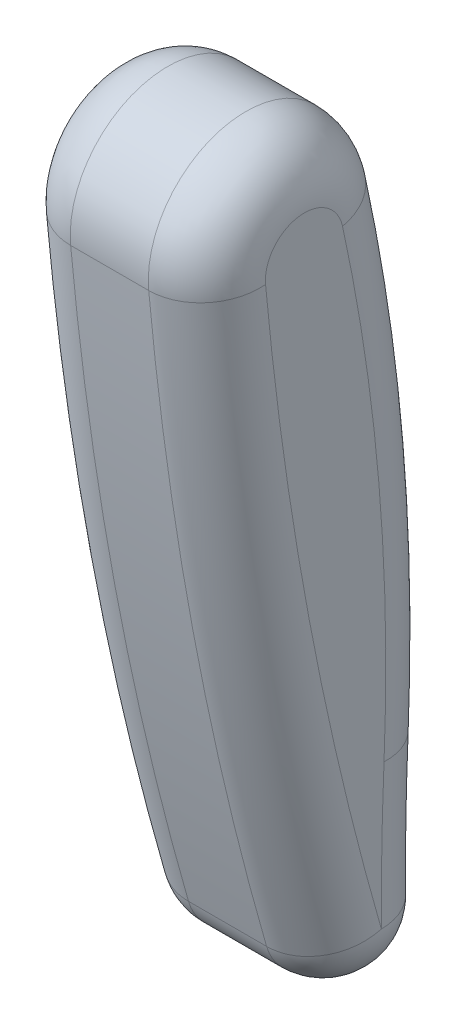
ISO-10303-21;
HEADER;
FILE_DESCRIPTION(('STEP AP214'),'2;1');
FILE_NAME('part.step','',(''),(''),'','','');
FILE_SCHEMA(('AUTOMOTIVE_DESIGN { 1 0 10303 214 1 1 1 1 }'));
ENDSEC;
DATA;
#1=APPLICATION_CONTEXT('core data for automotive mechanical design processes');
#2=APPLICATION_PROTOCOL_DEFINITION('international standard','automotive_design',2000,#1);
#3=PRODUCT_CONTEXT('',#1,'mechanical');
#4=PRODUCT('Part','Part','',(#3));
#5=PRODUCT_RELATED_PRODUCT_CATEGORY('part','',(#4));
#6=PRODUCT_DEFINITION_FORMATION('','',#4);
#7=PRODUCT_DEFINITION_CONTEXT('part definition',#1,'design');
#8=PRODUCT_DEFINITION('design','',#6,#7);
#9=PRODUCT_DEFINITION_SHAPE('','',#8);
#10=(LENGTH_UNIT() NAMED_UNIT(*) SI_UNIT(.MILLI.,.METRE.));
#11=(NAMED_UNIT(*) PLANE_ANGLE_UNIT() SI_UNIT($,.RADIAN.));
#12=(NAMED_UNIT(*) SI_UNIT($,.STERADIAN.) SOLID_ANGLE_UNIT());
#13=UNCERTAINTY_MEASURE_WITH_UNIT(LENGTH_MEASURE(1.E-05),#10,'distance_accuracy_value','');
#14=(GEOMETRIC_REPRESENTATION_CONTEXT(3) GLOBAL_UNCERTAINTY_ASSIGNED_CONTEXT((#13)) GLOBAL_UNIT_ASSIGNED_CONTEXT((#10,
#11,#12)) REPRESENTATION_CONTEXT('',''));
#15=CARTESIAN_POINT('',(0.,0.,0.));
#16=DIRECTION('',(0.,0.,1.));
#17=DIRECTION('',(1.,0.,0.));
#18=AXIS2_PLACEMENT_3D('',#15,#16,#17);
#19=CARTESIAN_POINT('',(177.8,-559.10903574724,-2113.11328138226));
#20=DIRECTION('',(-1.,0.,0.));
#21=DIRECTION('',(0.,0.,1.));
#22=AXIS2_PLACEMENT_3D('',#19,#20,#21);
#23=CYLINDRICAL_SURFACE('',#22,2209.8);
#24=DIRECTION('',(-1.,0.,0.));
#25=VECTOR('',#24,1.);
#26=CARTESIAN_POINT('',(177.8,-761.528986098875,87.3962513622892));
#27=LINE('',#26,#25);
#28=CARTESIAN_POINT('',(139.7,-761.528986098875,87.3962513622892));
#29=VERTEX_POINT('',#28);
#30=CARTESIAN_POINT('',(88.9,-761.528986098875,87.3962513622892));
#31=VERTEX_POINT('',#30);
#32=EDGE_CURVE('E188',#29,#31,#27,.T.);
#33=ORIENTED_EDGE('',*,*,#32,.T.);
#34=CARTESIAN_POINT('',(88.9,-559.10903574724,-2113.11328138226));
#35=DIRECTION('',(-1.,0.,0.));
#36=DIRECTION('',(0.,0.,1.));
#37=AXIS2_PLACEMENT_3D('',#34,#35,#36);
#38=CIRCLE('',#37,2209.8);
#39=CARTESIAN_POINT('',(88.9,-1169.53967872684,10.7017929854443));
#40=VERTEX_POINT('',#39);
#41=EDGE_CURVE('E158',#31,#40,#38,.F.);
#42=ORIENTED_EDGE('',*,*,#41,.T.);
#43=DIRECTION('',(-1.,0.,0.));
#44=VECTOR('',#43,1.);
#45=CARTESIAN_POINT('',(177.8,-1169.53967872684,10.7017929854443));
#46=LINE('',#45,#44);
#47=CARTESIAN_POINT('',(139.7,-1169.53967872684,10.7017929854443));
#48=VERTEX_POINT('',#47);
#49=EDGE_CURVE('E119',#48,#40,#46,.T.);
#50=ORIENTED_EDGE('',*,*,#49,.F.);
#51=CARTESIAN_POINT('',(139.7,-559.10903574724,-2113.11328138226));
#52=DIRECTION('',(-1.,0.,0.));
#53=DIRECTION('',(0.,0.,1.));
#54=AXIS2_PLACEMENT_3D('',#51,#52,#53);
#55=CIRCLE('',#54,2209.8);
#56=EDGE_CURVE('E156',#48,#29,#55,.T.);
#57=ORIENTED_EDGE('',*,*,#56,.T.);
#58=EDGE_LOOP('',(#33,#42,#50,#57));
#59=FACE_BOUND('',#58,.T.);
#60=ADVANCED_FACE('F30',(#59),#23,.T.);
#61=CARTESIAN_POINT('',(177.8,-1159.01501246857,-25.9157082967632));
#62=DIRECTION('',(-1.,0.,0.));
#63=DIRECTION('',(0.,0.,1.));
#64=AXIS2_PLACEMENT_3D('',#61,#62,#63);
#65=CYLINDRICAL_SURFACE('',#64,38.100000000006);
#66=ORIENTED_EDGE('',*,*,#49,.T.);
#67=CARTESIAN_POINT('',(88.9,-1159.01501246857,-25.9157082967632));
#68=DIRECTION('',(-1.,0.,0.));
#69=DIRECTION('',(0.,0.,1.));
#70=AXIS2_PLACEMENT_3D('',#67,#68,#69);
#71=CIRCLE('',#70,38.100000000006);
#72=CARTESIAN_POINT('',(88.9,-1158.77775860236,-64.01496958361));
#73=VERTEX_POINT('',#72);
#74=EDGE_CURVE('E109',#40,#73,#71,.F.);
#75=ORIENTED_EDGE('',*,*,#74,.T.);
#76=DIRECTION('',(-1.,0.,0.));
#77=VECTOR('',#76,1.);
#78=CARTESIAN_POINT('',(177.8,-1158.77775860236,-64.01496958361));
#79=LINE('',#78,#77);
#80=CARTESIAN_POINT('',(139.7,-1158.77775860236,-64.01496958361));
#81=VERTEX_POINT('',#80);
#82=EDGE_CURVE('E102',#81,#73,#79,.T.);
#83=ORIENTED_EDGE('',*,*,#82,.F.);
#84=CARTESIAN_POINT('',(139.7,-1159.01501246857,-25.9157082967632));
#85=DIRECTION('',(-1.,0.,0.));
#86=DIRECTION('',(0.,0.,1.));
#87=AXIS2_PLACEMENT_3D('',#84,#85,#86);
#88=CIRCLE('',#87,38.100000000006);
#89=EDGE_CURVE('E116',#81,#48,#88,.T.);
#90=ORIENTED_EDGE('',*,*,#89,.T.);
#91=EDGE_LOOP('',(#66,#75,#83,#90));
#92=FACE_BOUND('',#91,.T.);
#93=ADVANCED_FACE('F114',(#92),#65,.T.);
#94=CARTESIAN_POINT('',(177.8,-1147.29470222544,-1908.01427826088));
#95=DIRECTION('',(-1.,0.,0.));
#96=DIRECTION('',(0.,0.,1.));
#97=AXIS2_PLACEMENT_3D('',#94,#95,#96);
#98=CYLINDRICAL_SURFACE('',#97,1844.03506229844);
#99=ORIENTED_EDGE('',*,*,#82,.T.);
#100=CARTESIAN_POINT('',(88.9,-1147.29470222544,-1908.01427826088));
#101=DIRECTION('',(-1.,0.,0.));
#102=DIRECTION('',(0.,0.,1.));
#103=AXIS2_PLACEMENT_3D('',#100,#101,#102);
#104=CIRCLE('',#103,1844.03506229844);
#105=CARTESIAN_POINT('',(88.9,-1067.28642691419,-65.715717530908));
#106=VERTEX_POINT('',#105);
#107=EDGE_CURVE('E108',#73,#106,#104,.T.);
#108=ORIENTED_EDGE('',*,*,#107,.T.);
#109=DIRECTION('',(-1.,0.,0.));
#110=VECTOR('',#109,1.);
#111=CARTESIAN_POINT('',(177.8,-1067.28642691419,-65.715717530908));
#112=LINE('',#111,#110);
#113=CARTESIAN_POINT('',(139.7,-1067.28642691419,-65.715717530908));
#114=VERTEX_POINT('',#113);
#115=EDGE_CURVE('E104',#114,#106,#112,.T.);
#116=ORIENTED_EDGE('',*,*,#115,.F.);
#117=CARTESIAN_POINT('',(139.7,-1147.29470222544,-1908.01427826088));
#118=DIRECTION('',(-1.,0.,0.));
#119=DIRECTION('',(0.,0.,1.));
#120=AXIS2_PLACEMENT_3D('',#117,#118,#119);
#121=CIRCLE('',#120,1844.03506229844);
#122=EDGE_CURVE('E99',#114,#81,#121,.F.);
#123=ORIENTED_EDGE('',*,*,#122,.T.);
#124=EDGE_LOOP('',(#99,#108,#116,#123));
#125=FACE_BOUND('',#124,.T.);
#126=ADVANCED_FACE('F101',(#125),#98,.F.);
#127=CARTESIAN_POINT('',(177.8,-1012.18416138642,1203.08834154745));
#128=DIRECTION('',(-1.,0.,0.));
#129=DIRECTION('',(0.,0.,1.));
#130=AXIS2_PLACEMENT_3D('',#127,#128,#129);
#131=CYLINDRICAL_SURFACE('',#130,1270.);
#132=ORIENTED_EDGE('',*,*,#115,.T.);
#133=CARTESIAN_POINT('',(88.9,-1012.18416138642,1203.08834154745));
#134=DIRECTION('',(-1.,0.,0.));
#135=DIRECTION('',(0.,0.,1.));
#136=AXIS2_PLACEMENT_3D('',#133,#134,#135);
#137=CIRCLE('',#136,1270.);
#138=CARTESIAN_POINT('',(88.9,-742.213802936383,-37.8854718581223));
#139=VERTEX_POINT('',#138);
#140=EDGE_CURVE('E149',#106,#139,#137,.F.);
#141=ORIENTED_EDGE('',*,*,#140,.T.);
#142=DIRECTION('',(-1.,0.,0.));
#143=VECTOR('',#142,1.);
#144=CARTESIAN_POINT('',(177.8,-742.213802936383,-37.8854718581223));
#145=LINE('',#144,#143);
#146=CARTESIAN_POINT('',(139.7,-742.213802936383,-37.8854718581223));
#147=VERTEX_POINT('',#146);
#148=EDGE_CURVE('E191',#147,#139,#145,.T.);
#149=ORIENTED_EDGE('',*,*,#148,.F.);
#150=CARTESIAN_POINT('',(139.7,-1012.18416138642,1203.08834154745));
#151=DIRECTION('',(-1.,0.,0.));
#152=DIRECTION('',(0.,0.,1.));
#153=AXIS2_PLACEMENT_3D('',#150,#151,#152);
#154=CIRCLE('',#153,1270.);
#155=EDGE_CURVE('E147',#147,#114,#154,.T.);
#156=ORIENTED_EDGE('',*,*,#155,.T.);
#157=EDGE_LOOP('',(#132,#141,#149,#156));
#158=FACE_BOUND('',#157,.T.);
#159=ADVANCED_FACE('F196',(#158),#131,.T.);
#160=CARTESIAN_POINT('',(177.8,-755.712320858886,24.1632188121575));
#161=DIRECTION('',(-1.,0.,0.));
#162=DIRECTION('',(0.,0.,1.));
#163=AXIS2_PLACEMENT_3D('',#160,#161,#162);
#164=CYLINDRICAL_SURFACE('',#163,63.5000000000009);
#165=ORIENTED_EDGE('',*,*,#148,.T.);
#166=CARTESIAN_POINT('',(88.9,-755.712320858886,24.1632188121575));
#167=DIRECTION('',(-1.,0.,0.));
#168=DIRECTION('',(0.,0.,1.));
#169=AXIS2_PLACEMENT_3D('',#166,#167,#168);
#170=CIRCLE('',#169,63.5000000000009);
#171=EDGE_CURVE('E154',#139,#31,#170,.F.);
#172=ORIENTED_EDGE('',*,*,#171,.T.);
#173=ORIENTED_EDGE('',*,*,#32,.F.);
#174=CARTESIAN_POINT('',(139.7,-755.712320858886,24.1632188121575));
#175=DIRECTION('',(-1.,0.,0.));
#176=DIRECTION('',(0.,0.,1.));
#177=AXIS2_PLACEMENT_3D('',#174,#175,#176);
#178=CIRCLE('',#177,63.5000000000009);
#179=EDGE_CURVE('E151',#29,#147,#178,.T.);
#180=ORIENTED_EDGE('',*,*,#179,.T.);
#181=EDGE_LOOP('',(#165,#172,#173,#180));
#182=FACE_BOUND('',#181,.T.);
#183=ADVANCED_FACE('F219',(#182),#164,.T.);
#184=CARTESIAN_POINT('',(177.8,-657.410678303063,-1044.47503128505));
#185=DIRECTION('',(-1.,0.,0.));
#186=DIRECTION('',(0.,0.,1.));
#187=AXIS2_PLACEMENT_3D('',#184,#185,#186);
#188=PLANE('',#187);
#189=CARTESIAN_POINT('',(177.8,-1012.18416138642,1203.08834154745));
#190=DIRECTION('',(-1.,0.,0.));
#191=DIRECTION('',(0.,0.,1.));
#192=AXIS2_PLACEMENT_3D('',#189,#190,#191);
#193=CIRCLE('',#192,1231.9);
#194=CARTESIAN_POINT('',(177.8,-1065.63335894836,-27.6515957585574));
#195=VERTEX_POINT('',#194);
#196=CARTESIAN_POINT('',(177.8,-750.312913689884,-0.656257455955257));
#197=VERTEX_POINT('',#196);
#198=EDGE_CURVE('E37',#195,#197,#193,.F.);
#199=ORIENTED_EDGE('',*,*,#198,.T.);
#200=CARTESIAN_POINT('',(177.8,-755.712320858886,24.1632188121575));
#201=DIRECTION('',(-1.,0.,0.));
#202=DIRECTION('',(0.,0.,1.));
#203=AXIS2_PLACEMENT_3D('',#200,#201,#202);
#204=CIRCLE('',#203,25.4000000000009);
#205=CARTESIAN_POINT('',(177.8,-758.038986954881,49.4564318322102));
#206=VERTEX_POINT('',#205);
#207=EDGE_CURVE('E11',#197,#206,#204,.F.);
#208=ORIENTED_EDGE('',*,*,#207,.T.);
#209=CARTESIAN_POINT('',(177.8,-559.10903574724,-2113.11328138226));
#210=DIRECTION('',(-1.,0.,0.));
#211=DIRECTION('',(0.,0.,1.));
#212=AXIS2_PLACEMENT_3D('',#209,#210,#211);
#213=CIRCLE('',#212,2171.7);
#214=CARTESIAN_POINT('',(177.8,-1159.01501246858,-25.9157082967574));
#215=VERTEX_POINT('',#214);
#216=EDGE_CURVE('E160',#206,#215,#213,.F.);
#217=ORIENTED_EDGE('',*,*,#216,.T.);
#218=CARTESIAN_POINT('',(177.8,-1147.29470222544,-1908.01427826088));
#219=DIRECTION('',(-1.,0.,0.));
#220=DIRECTION('',(0.,0.,1.));
#221=AXIS2_PLACEMENT_3D('',#218,#219,#220);
#222=CIRCLE('',#221,1882.13506229844);
#223=EDGE_CURVE('E47',#215,#195,#222,.T.);
#224=ORIENTED_EDGE('',*,*,#223,.T.);
#225=EDGE_LOOP('',(#199,#208,#217,#224));
#226=FACE_BOUND('',#225,.T.);
#227=ADVANCED_FACE('F163',(#226),#188,.F.);
#228=CARTESIAN_POINT('',(50.8,-657.410678303063,-1044.47503128505));
#229=DIRECTION('',(-1.,0.,0.));
#230=DIRECTION('',(0.,0.,1.));
#231=AXIS2_PLACEMENT_3D('',#228,#229,#230);
#232=PLANE('',#231);
#233=CARTESIAN_POINT('',(50.8,-1012.18416138642,1203.08834154745));
#234=DIRECTION('',(-1.,0.,0.));
#235=DIRECTION('',(0.,0.,1.));
#236=AXIS2_PLACEMENT_3D('',#233,#234,#235);
#237=CIRCLE('',#236,1231.9);
#238=CARTESIAN_POINT('',(50.8,-750.312913689885,-0.656257455954763));
#239=VERTEX_POINT('',#238);
#240=CARTESIAN_POINT('',(50.8,-1065.63335894836,-27.6515957585574));
#241=VERTEX_POINT('',#240);
#242=EDGE_CURVE('E142',#239,#241,#237,.T.);
#243=ORIENTED_EDGE('',*,*,#242,.T.);
#244=CARTESIAN_POINT('',(50.8,-1147.29470222544,-1908.01427826088));
#245=DIRECTION('',(-1.,0.,0.));
#246=DIRECTION('',(0.,0.,1.));
#247=AXIS2_PLACEMENT_3D('',#244,#245,#246);
#248=CIRCLE('',#247,1882.13506229844);
#249=CARTESIAN_POINT('',(50.8,-1159.01501246858,-25.9157082967574));
#250=VERTEX_POINT('',#249);
#251=EDGE_CURVE('E144',#241,#250,#248,.F.);
#252=ORIENTED_EDGE('',*,*,#251,.T.);
#253=CARTESIAN_POINT('',(50.8,-559.10903574724,-2113.11328138226));
#254=DIRECTION('',(-1.,0.,0.));
#255=DIRECTION('',(0.,0.,1.));
#256=AXIS2_PLACEMENT_3D('',#253,#254,#255);
#257=CIRCLE('',#256,2171.7);
#258=CARTESIAN_POINT('',(50.8,-758.038986954881,49.4564318322102));
#259=VERTEX_POINT('',#258);
#260=EDGE_CURVE('E138',#250,#259,#257,.T.);
#261=ORIENTED_EDGE('',*,*,#260,.T.);
#262=CARTESIAN_POINT('',(50.8,-755.712320858886,24.1632188121575));
#263=DIRECTION('',(-1.,0.,0.));
#264=DIRECTION('',(0.,0.,1.));
#265=AXIS2_PLACEMENT_3D('',#262,#263,#264);
#266=CIRCLE('',#265,25.4000000000009);
#267=EDGE_CURVE('E140',#259,#239,#266,.T.);
#268=ORIENTED_EDGE('',*,*,#267,.T.);
#269=EDGE_LOOP('',(#243,#252,#261,#268));
#270=FACE_BOUND('',#269,.T.);
#271=ADVANCED_FACE('F209',(#270),#232,.T.);
#272=CARTESIAN_POINT('',(88.9,-755.712320858886,24.1632188121575));
#273=DIRECTION('',(-1.,0.,0.));
#274=DIRECTION('',(0.,0.,1.));
#275=AXIS2_PLACEMENT_3D('',#272,#273,#274);
#276=DEGENERATE_TOROIDAL_SURFACE('',#275,25.4000000000009,38.1,.T.);
#277=CARTESIAN_POINT('',(88.9,-758.038986954881,49.4564318322107));
#278=DIRECTION('',(0.,-0.995795788191036,-0.0916010274014102));
#279=DIRECTION('',(0.,0.0916010274014102,-0.995795788191036));
#280=AXIS2_PLACEMENT_3D('',#277,#278,#279);
#281=CIRCLE('',#280,38.1);
#282=EDGE_CURVE('E182',#31,#259,#281,.T.);
#283=ORIENTED_EDGE('',*,*,#282,.F.);
#284=ORIENTED_EDGE('',*,*,#171,.F.);
#285=CARTESIAN_POINT('',(88.9,-750.312913689885,-0.656257455954763));
#286=DIRECTION('',(0.,-0.977144734965015,-0.21257508539373));
#287=DIRECTION('',(0.,0.21257508539373,-0.977144734965015));
#288=AXIS2_PLACEMENT_3D('',#285,#286,#287);
#289=CIRCLE('',#288,38.1);
#290=EDGE_CURVE('E185',#239,#139,#289,.T.);
#291=ORIENTED_EDGE('',*,*,#290,.F.);
#292=ORIENTED_EDGE('',*,*,#267,.F.);
#293=EDGE_LOOP('',(#283,#284,#291,#292));
#294=FACE_BOUND('',#293,.T.);
#295=ADVANCED_FACE('F215',(#294),#276,.T.);
#296=CARTESIAN_POINT('',(88.9,-1012.18416138642,1203.08834154745));
#297=DIRECTION('',(-1.,0.,0.));
#298=DIRECTION('',(0.,0.,1.));
#299=AXIS2_PLACEMENT_3D('',#296,#297,#298);
#300=TOROIDAL_SURFACE('',#299,1231.9,38.1);
#301=ORIENTED_EDGE('',*,*,#290,.T.);
#302=ORIENTED_EDGE('',*,*,#140,.F.);
#303=CARTESIAN_POINT('',(88.9,-1065.63335894836,-27.6515957585574));
#304=DIRECTION('',(0.,-0.999058314234924,0.0433876106517869));
#305=DIRECTION('',(0.,-0.0433876106517869,-0.999058314234924));
#306=AXIS2_PLACEMENT_3D('',#303,#304,#305);
#307=CIRCLE('',#306,38.1);
#308=EDGE_CURVE('E179',#241,#106,#307,.T.);
#309=ORIENTED_EDGE('',*,*,#308,.F.);
#310=ORIENTED_EDGE('',*,*,#242,.F.);
#311=EDGE_LOOP('',(#301,#302,#309,#310));
#312=FACE_BOUND('',#311,.T.);
#313=ADVANCED_FACE('F201',(#312),#300,.T.);
#314=CARTESIAN_POINT('',(88.9,-559.10903574724,-2113.11328138226));
#315=DIRECTION('',(-1.,0.,0.));
#316=DIRECTION('',(0.,0.,1.));
#317=AXIS2_PLACEMENT_3D('',#314,#315,#316);
#318=TOROIDAL_SURFACE('',#317,2171.7,38.1);
#319=ORIENTED_EDGE('',*,*,#282,.T.);
#320=ORIENTED_EDGE('',*,*,#260,.F.);
#321=CARTESIAN_POINT('',(88.9,-1159.01501246858,-25.9157082967579));
#322=DIRECTION('',(0.,-0.961089272498736,-0.276237959534619));
#323=DIRECTION('',(0.,0.276237959534619,-0.961089272498736));
#324=AXIS2_PLACEMENT_3D('',#321,#322,#323);
#325=CIRCLE('',#324,38.1);
#326=EDGE_CURVE('E176',#40,#250,#325,.T.);
#327=ORIENTED_EDGE('',*,*,#326,.F.);
#328=ORIENTED_EDGE('',*,*,#41,.F.);
#329=EDGE_LOOP('',(#319,#320,#327,#328));
#330=FACE_BOUND('',#329,.T.);
#331=ADVANCED_FACE('F224',(#330),#318,.T.);
#332=CARTESIAN_POINT('',(88.9,-1147.29470222544,-1908.01427826088));
#333=DIRECTION('',(-1.,0.,0.));
#334=DIRECTION('',(0.,0.,1.));
#335=AXIS2_PLACEMENT_3D('',#332,#333,#334);
#336=TOROIDAL_SURFACE('',#335,1882.13506229844,38.1);
#337=ORIENTED_EDGE('',*,*,#308,.T.);
#338=ORIENTED_EDGE('',*,*,#107,.F.);
#339=CARTESIAN_POINT('',(88.9,-1159.01501246857,-25.9157082967687));
#340=DIRECTION('',(0.,-0.999980611203171,-0.00622713559611798));
#341=DIRECTION('',(0.,0.00622713559611798,-0.999980611203171));
#342=AXIS2_PLACEMENT_3D('',#339,#340,#341);
#343=CIRCLE('',#342,38.1);
#344=EDGE_CURVE('E127',#250,#73,#343,.T.);
#345=ORIENTED_EDGE('',*,*,#344,.F.);
#346=ORIENTED_EDGE('',*,*,#251,.F.);
#347=EDGE_LOOP('',(#337,#338,#345,#346));
#348=FACE_BOUND('',#347,.T.);
#349=ADVANCED_FACE('F207',(#348),#336,.T.);
#350=CARTESIAN_POINT('',(88.9,-1159.01501246857,-25.9157082967632));
#351=DIRECTION('',(0.,0.,1.));
#352=DIRECTION('',(1.,0.,0.));
#353=AXIS2_PLACEMENT_3D('',#350,#351,#352);
#354=SPHERICAL_SURFACE('',#353,38.1);
#355=ORIENTED_EDGE('',*,*,#74,.F.);
#356=ORIENTED_EDGE('',*,*,#326,.T.);
#357=ORIENTED_EDGE('',*,*,#344,.T.);
#358=EDGE_LOOP('',(#355,#356,#357));
#359=FACE_BOUND('',#358,.T.);
#360=ADVANCED_FACE('F226',(#359),#354,.T.);
#361=CARTESIAN_POINT('',(139.7,-1147.29470222544,-1908.01427826088));
#362=DIRECTION('',(-1.,0.,0.));
#363=DIRECTION('',(0.,0.,1.));
#364=AXIS2_PLACEMENT_3D('',#361,#362,#363);
#365=TOROIDAL_SURFACE('',#364,1882.13506229844,38.1);
#366=CARTESIAN_POINT('',(139.7,-1159.01501246857,-25.9157082967687));
#367=DIRECTION('',(0.,-0.999980611203171,-0.00622713559611215));
#368=DIRECTION('',(0.,0.00622713559611215,-0.999980611203171));
#369=AXIS2_PLACEMENT_3D('',#366,#367,#368);
#370=CIRCLE('',#369,38.1);
#371=EDGE_CURVE('E122',#81,#215,#370,.T.);
#372=ORIENTED_EDGE('',*,*,#371,.F.);
#373=ORIENTED_EDGE('',*,*,#122,.F.);
#374=CARTESIAN_POINT('',(139.7,-1065.63335894836,-27.6515957585574));
#375=DIRECTION('',(0.,0.999058314234924,-0.0433876106517871));
#376=DIRECTION('',(0.,0.0433876106517871,0.999058314234924));
#377=AXIS2_PLACEMENT_3D('',#374,#375,#376);
#378=CIRCLE('',#377,38.1);
#379=EDGE_CURVE('E128',#195,#114,#378,.T.);
#380=ORIENTED_EDGE('',*,*,#379,.F.);
#381=ORIENTED_EDGE('',*,*,#223,.F.);
#382=EDGE_LOOP('',(#372,#373,#380,#381));
#383=FACE_BOUND('',#382,.T.);
#384=ADVANCED_FACE('F123',(#383),#365,.T.);
#385=CARTESIAN_POINT('',(139.7,-1159.01501246857,-25.9157082967632));
#386=DIRECTION('',(0.,0.,1.));
#387=DIRECTION('',(1.,0.,0.));
#388=AXIS2_PLACEMENT_3D('',#385,#386,#387);
#389=SPHERICAL_SURFACE('',#388,38.1);
#390=ORIENTED_EDGE('',*,*,#89,.F.);
#391=ORIENTED_EDGE('',*,*,#371,.T.);
#392=CARTESIAN_POINT('',(139.7,-1159.01501246858,-25.9157082967574));
#393=DIRECTION('',(0.,0.961089272498733,0.27623795953463));
#394=DIRECTION('',(0.,-0.27623795953463,0.961089272498733));
#395=AXIS2_PLACEMENT_3D('',#392,#393,#394);
#396=CIRCLE('',#395,38.1);
#397=EDGE_CURVE('E131',#48,#215,#396,.T.);
#398=ORIENTED_EDGE('',*,*,#397,.F.);
#399=EDGE_LOOP('',(#390,#391,#398));
#400=FACE_BOUND('',#399,.T.);
#401=ADVANCED_FACE('F130',(#400),#389,.T.);
#402=CARTESIAN_POINT('',(139.7,-1012.18416138642,1203.08834154745));
#403=DIRECTION('',(-1.,0.,0.));
#404=DIRECTION('',(0.,0.,1.));
#405=AXIS2_PLACEMENT_3D('',#402,#403,#404);
#406=TOROIDAL_SURFACE('',#405,1231.9,38.1);
#407=ORIENTED_EDGE('',*,*,#379,.T.);
#408=ORIENTED_EDGE('',*,*,#155,.F.);
#409=CARTESIAN_POINT('',(139.7,-750.312913689884,-0.656257455955257));
#410=DIRECTION('',(0.,0.977144734965014,0.21257508539373));
#411=DIRECTION('',(0.,-0.21257508539373,0.977144734965014));
#412=AXIS2_PLACEMENT_3D('',#409,#410,#411);
#413=CIRCLE('',#412,38.1);
#414=EDGE_CURVE('E169',#197,#147,#413,.T.);
#415=ORIENTED_EDGE('',*,*,#414,.F.);
#416=ORIENTED_EDGE('',*,*,#198,.F.);
#417=EDGE_LOOP('',(#407,#408,#415,#416));
#418=FACE_BOUND('',#417,.T.);
#419=ADVANCED_FACE('F284',(#418),#406,.T.);
#420=CARTESIAN_POINT('',(139.7,-559.10903574724,-2113.11328138226));
#421=DIRECTION('',(-1.,0.,0.));
#422=DIRECTION('',(0.,0.,1.));
#423=AXIS2_PLACEMENT_3D('',#420,#421,#422);
#424=TOROIDAL_SURFACE('',#423,2171.7,38.1);
#425=ORIENTED_EDGE('',*,*,#397,.T.);
#426=ORIENTED_EDGE('',*,*,#216,.F.);
#427=CARTESIAN_POINT('',(139.7,-758.038986954881,49.4564318322102));
#428=DIRECTION('',(0.,0.995795788191036,0.0916010274014102));
#429=DIRECTION('',(0.,-0.0916010274014102,0.995795788191036));
#430=AXIS2_PLACEMENT_3D('',#427,#428,#429);
#431=CIRCLE('',#430,38.1);
#432=EDGE_CURVE('E168',#29,#206,#431,.T.);
#433=ORIENTED_EDGE('',*,*,#432,.F.);
#434=ORIENTED_EDGE('',*,*,#56,.F.);
#435=EDGE_LOOP('',(#425,#426,#433,#434));
#436=FACE_BOUND('',#435,.T.);
#437=ADVANCED_FACE('F167',(#436),#424,.T.);
#438=CARTESIAN_POINT('',(139.7,-755.712320858886,24.1632188121575));
#439=DIRECTION('',(-1.,0.,0.));
#440=DIRECTION('',(0.,0.,1.));
#441=AXIS2_PLACEMENT_3D('',#438,#439,#440);
#442=DEGENERATE_TOROIDAL_SURFACE('',#441,25.4000000000009,38.1,.T.);
#443=ORIENTED_EDGE('',*,*,#414,.T.);
#444=ORIENTED_EDGE('',*,*,#179,.F.);
#445=ORIENTED_EDGE('',*,*,#432,.T.);
#446=ORIENTED_EDGE('',*,*,#207,.F.);
#447=EDGE_LOOP('',(#443,#444,#445,#446));
#448=FACE_BOUND('',#447,.T.);
#449=ADVANCED_FACE('F302',(#448),#442,.T.);
#450=CLOSED_SHELL('',(#60,#93,#126,#159,#183,#227,#271,#295,#313,#331,#349,#360,#384,#401,#419,
#437,#449));
#451=MANIFOLD_SOLID_BREP('B2',#450);
#452=ADVANCED_BREP_SHAPE_REPRESENTATION('',(#18,#451),#14);
#453=SHAPE_DEFINITION_REPRESENTATION(#9,#452);
ENDSEC;
END-ISO-10303-21;
